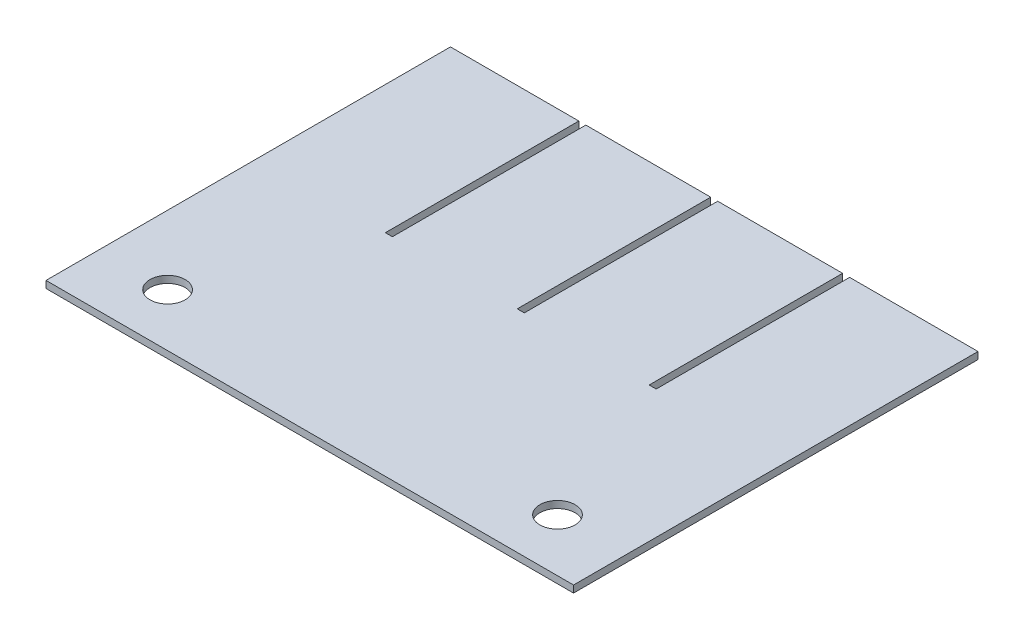
ISO-10303-21;
HEADER;
FILE_DESCRIPTION(('STEP AP214'),'2;1');
FILE_NAME('part.step','',(''),(''),'','','');
FILE_SCHEMA(('AUTOMOTIVE_DESIGN { 1 0 10303 214 1 1 1 1 }'));
ENDSEC;
DATA;
#1=APPLICATION_CONTEXT('core data for automotive mechanical design processes');
#2=APPLICATION_PROTOCOL_DEFINITION('international standard','automotive_design',2000,#1);
#3=PRODUCT_CONTEXT('',#1,'mechanical');
#4=PRODUCT('Part','Part','',(#3));
#5=PRODUCT_RELATED_PRODUCT_CATEGORY('part','',(#4));
#6=PRODUCT_DEFINITION_FORMATION('','',#4);
#7=PRODUCT_DEFINITION_CONTEXT('part definition',#1,'design');
#8=PRODUCT_DEFINITION('design','',#6,#7);
#9=PRODUCT_DEFINITION_SHAPE('','',#8);
#10=(LENGTH_UNIT() NAMED_UNIT(*) SI_UNIT(.MILLI.,.METRE.));
#11=(NAMED_UNIT(*) PLANE_ANGLE_UNIT() SI_UNIT($,.RADIAN.));
#12=(NAMED_UNIT(*) SI_UNIT($,.STERADIAN.) SOLID_ANGLE_UNIT());
#13=UNCERTAINTY_MEASURE_WITH_UNIT(LENGTH_MEASURE(1.E-05),#10,'distance_accuracy_value','');
#14=(GEOMETRIC_REPRESENTATION_CONTEXT(3) GLOBAL_UNCERTAINTY_ASSIGNED_CONTEXT((#13)) GLOBAL_UNIT_ASSIGNED_CONTEXT((#10,
#11,#12)) REPRESENTATION_CONTEXT('',''));
#15=CARTESIAN_POINT('',(0.,0.,0.));
#16=DIRECTION('',(0.,0.,1.));
#17=DIRECTION('',(1.,0.,0.));
#18=AXIS2_PLACEMENT_3D('',#15,#16,#17);
#19=CARTESIAN_POINT('',(0.,2.,0.));
#20=DIRECTION('',(0.,1.,0.));
#21=DIRECTION('',(0.,0.,1.));
#22=AXIS2_PLACEMENT_3D('',#19,#20,#21);
#23=PLANE('',#22);
#24=CARTESIAN_POINT('',(-55.4347826086956,2.,42.5));
#25=DIRECTION('',(0.,1.,0.));
#26=DIRECTION('',(0.,0.,1.));
#27=AXIS2_PLACEMENT_3D('',#24,#25,#26);
#28=CIRCLE('',#27,5.);
#29=CARTESIAN_POINT('',(-55.4347826086956,2.,47.5));
#30=VERTEX_POINT('',#29);
#31=EDGE_CURVE('E188',#30,#30,#28,.T.);
#32=ORIENTED_EDGE('',*,*,#31,.F.);
#33=EDGE_LOOP('',(#32));
#34=FACE_BOUND('',#33,.T.);
#35=DIRECTION('',(0.,0.,-1.));
#36=VECTOR('',#35,1.);
#37=CARTESIAN_POINT('',(75.,2.,-57.5));
#38=LINE('',#37,#36);
#39=CARTESIAN_POINT('',(75.,2.,57.5));
#40=VERTEX_POINT('',#39);
#41=CARTESIAN_POINT('',(75.,2.,-57.5));
#42=VERTEX_POINT('',#41);
#43=EDGE_CURVE('E215',#40,#42,#38,.T.);
#44=ORIENTED_EDGE('',*,*,#43,.T.);
#45=DIRECTION('',(-1.,0.,0.));
#46=VECTOR('',#45,1.);
#47=CARTESIAN_POINT('',(38.5,2.,-57.5));
#48=LINE('',#47,#46);
#49=CARTESIAN_POINT('',(38.5,2.,-57.5));
#50=VERTEX_POINT('',#49);
#51=EDGE_CURVE('E123',#42,#50,#48,.T.);
#52=ORIENTED_EDGE('',*,*,#51,.T.);
#53=DIRECTION('',(0.,0.,1.));
#54=VECTOR('',#53,1.);
#55=CARTESIAN_POINT('',(38.5,2.,-57.5));
#56=LINE('',#55,#54);
#57=CARTESIAN_POINT('',(38.5,2.,-2.5));
#58=VERTEX_POINT('',#57);
#59=EDGE_CURVE('E254',#50,#58,#56,.T.);
#60=ORIENTED_EDGE('',*,*,#59,.T.);
#61=DIRECTION('',(-1.,0.,0.));
#62=VECTOR('',#61,1.);
#63=CARTESIAN_POINT('',(38.5,2.,-2.5));
#64=LINE('',#63,#62);
#65=CARTESIAN_POINT('',(36.5,2.,-2.5));
#66=VERTEX_POINT('',#65);
#67=EDGE_CURVE('E273',#58,#66,#64,.T.);
#68=ORIENTED_EDGE('',*,*,#67,.T.);
#69=DIRECTION('',(0.,0.,-1.));
#70=VECTOR('',#69,1.);
#71=CARTESIAN_POINT('',(36.5,2.,-57.5));
#72=LINE('',#71,#70);
#73=CARTESIAN_POINT('',(36.5,2.,-57.5));
#74=VERTEX_POINT('',#73);
#75=EDGE_CURVE('E270',#66,#74,#72,.T.);
#76=ORIENTED_EDGE('',*,*,#75,.T.);
#77=DIRECTION('',(-1.,0.,0.));
#78=VECTOR('',#77,1.);
#79=CARTESIAN_POINT('',(1.00000000000003,2.,-57.5));
#80=LINE('',#79,#78);
#81=CARTESIAN_POINT('',(1.00000000000003,2.,-57.5));
#82=VERTEX_POINT('',#81);
#83=EDGE_CURVE('E272',#74,#82,#80,.T.);
#84=ORIENTED_EDGE('',*,*,#83,.T.);
#85=DIRECTION('',(0.,0.,1.));
#86=VECTOR('',#85,1.);
#87=CARTESIAN_POINT('',(1.00000000000003,2.,-57.5));
#88=LINE('',#87,#86);
#89=CARTESIAN_POINT('',(1.00000000000003,2.,-2.5));
#90=VERTEX_POINT('',#89);
#91=EDGE_CURVE('E275',#82,#90,#88,.T.);
#92=ORIENTED_EDGE('',*,*,#91,.T.);
#93=DIRECTION('',(-1.,0.,0.));
#94=VECTOR('',#93,1.);
#95=CARTESIAN_POINT('',(-0.999999999999966,2.,-2.5));
#96=LINE('',#95,#94);
#97=CARTESIAN_POINT('',(-0.999999999999966,2.,-2.5));
#98=VERTEX_POINT('',#97);
#99=EDGE_CURVE('E281',#90,#98,#96,.T.);
#100=ORIENTED_EDGE('',*,*,#99,.T.);
#101=DIRECTION('',(0.,0.,-1.));
#102=VECTOR('',#101,1.);
#103=CARTESIAN_POINT('',(-0.999999999999973,2.,-57.5));
#104=LINE('',#103,#102);
#105=CARTESIAN_POINT('',(-0.999999999999973,2.,-57.5));
#106=VERTEX_POINT('',#105);
#107=EDGE_CURVE('E283',#98,#106,#104,.T.);
#108=ORIENTED_EDGE('',*,*,#107,.T.);
#109=DIRECTION('',(-1.,0.,0.));
#110=VECTOR('',#109,1.);
#111=CARTESIAN_POINT('',(-36.5,2.,-57.5));
#112=LINE('',#111,#110);
#113=CARTESIAN_POINT('',(-36.5,2.,-57.5));
#114=VERTEX_POINT('',#113);
#115=EDGE_CURVE('E285',#106,#114,#112,.T.);
#116=ORIENTED_EDGE('',*,*,#115,.T.);
#117=DIRECTION('',(0.,0.,1.));
#118=VECTOR('',#117,1.);
#119=CARTESIAN_POINT('',(-36.5,2.,-57.5));
#120=LINE('',#119,#118);
#121=CARTESIAN_POINT('',(-36.5,2.,-2.5));
#122=VERTEX_POINT('',#121);
#123=EDGE_CURVE('E287',#114,#122,#120,.T.);
#124=ORIENTED_EDGE('',*,*,#123,.T.);
#125=DIRECTION('',(-1.,0.,0.));
#126=VECTOR('',#125,1.);
#127=CARTESIAN_POINT('',(-38.5,2.,-2.5));
#128=LINE('',#127,#126);
#129=CARTESIAN_POINT('',(-38.5,2.,-2.5));
#130=VERTEX_POINT('',#129);
#131=EDGE_CURVE('E289',#122,#130,#128,.T.);
#132=ORIENTED_EDGE('',*,*,#131,.T.);
#133=DIRECTION('',(0.,0.,-1.));
#134=VECTOR('',#133,1.);
#135=CARTESIAN_POINT('',(-38.5,2.,-57.5));
#136=LINE('',#135,#134);
#137=CARTESIAN_POINT('',(-38.5,2.,-57.5));
#138=VERTEX_POINT('',#137);
#139=EDGE_CURVE('E166',#130,#138,#136,.T.);
#140=ORIENTED_EDGE('',*,*,#139,.T.);
#141=DIRECTION('',(-1.,0.,0.));
#142=VECTOR('',#141,1.);
#143=CARTESIAN_POINT('',(-75.,2.,-57.5));
#144=LINE('',#143,#142);
#145=CARTESIAN_POINT('',(-75.,2.,-57.5));
#146=VERTEX_POINT('',#145);
#147=EDGE_CURVE('E160',#138,#146,#144,.T.);
#148=ORIENTED_EDGE('',*,*,#147,.T.);
#149=DIRECTION('',(0.,0.,1.));
#150=VECTOR('',#149,1.);
#151=CARTESIAN_POINT('',(-75.,2.,-57.5));
#152=LINE('',#151,#150);
#153=CARTESIAN_POINT('',(-75.,2.,57.5));
#154=VERTEX_POINT('',#153);
#155=EDGE_CURVE('E164',#146,#154,#152,.T.);
#156=ORIENTED_EDGE('',*,*,#155,.T.);
#157=DIRECTION('',(1.,0.,0.));
#158=VECTOR('',#157,1.);
#159=CARTESIAN_POINT('',(-75.,2.,57.5));
#160=LINE('',#159,#158);
#161=EDGE_CURVE('E56',#154,#40,#160,.T.);
#162=ORIENTED_EDGE('',*,*,#161,.T.);
#163=EDGE_LOOP('',(#44,#52,#60,#68,#76,#84,#92,#100,#108,#116,#124,#132,#140,#148,#156,#162));
#164=FACE_BOUND('',#163,.T.);
#165=CARTESIAN_POINT('',(55.4347826086957,2.,42.5));
#166=DIRECTION('',(0.,1.,0.));
#167=DIRECTION('',(0.,0.,1.));
#168=AXIS2_PLACEMENT_3D('',#165,#166,#167);
#169=CIRCLE('',#168,5.);
#170=CARTESIAN_POINT('',(55.4347826086957,2.,47.5));
#171=VERTEX_POINT('',#170);
#172=EDGE_CURVE('E331',#171,#171,#169,.T.);
#173=ORIENTED_EDGE('',*,*,#172,.F.);
#174=EDGE_LOOP('',(#173));
#175=FACE_BOUND('',#174,.T.);
#176=ADVANCED_FACE('F39',(#34,#164,#175),#23,.T.);
#177=CARTESIAN_POINT('',(0.,0.,0.));
#178=DIRECTION('',(0.,1.,0.));
#179=DIRECTION('',(0.,0.,1.));
#180=AXIS2_PLACEMENT_3D('',#177,#178,#179);
#181=PLANE('',#180);
#182=DIRECTION('',(0.,0.,-1.));
#183=VECTOR('',#182,1.);
#184=CARTESIAN_POINT('',(75.,0.,-57.5));
#185=LINE('',#184,#183);
#186=CARTESIAN_POINT('',(75.,0.,57.5));
#187=VERTEX_POINT('',#186);
#188=CARTESIAN_POINT('',(75.,0.,-57.5));
#189=VERTEX_POINT('',#188);
#190=EDGE_CURVE('E184',#187,#189,#185,.T.);
#191=ORIENTED_EDGE('',*,*,#190,.F.);
#192=DIRECTION('',(1.,0.,0.));
#193=VECTOR('',#192,1.);
#194=CARTESIAN_POINT('',(-75.,0.,57.5));
#195=LINE('',#194,#193);
#196=CARTESIAN_POINT('',(-75.,0.,57.5));
#197=VERTEX_POINT('',#196);
#198=EDGE_CURVE('E115',#197,#187,#195,.T.);
#199=ORIENTED_EDGE('',*,*,#198,.F.);
#200=DIRECTION('',(0.,0.,1.));
#201=VECTOR('',#200,1.);
#202=CARTESIAN_POINT('',(-75.,0.,-57.5));
#203=LINE('',#202,#201);
#204=CARTESIAN_POINT('',(-75.,0.,-57.5));
#205=VERTEX_POINT('',#204);
#206=EDGE_CURVE('E109',#205,#197,#203,.T.);
#207=ORIENTED_EDGE('',*,*,#206,.F.);
#208=DIRECTION('',(-1.,0.,0.));
#209=VECTOR('',#208,1.);
#210=CARTESIAN_POINT('',(-75.,0.,-57.5));
#211=LINE('',#210,#209);
#212=CARTESIAN_POINT('',(-38.5,0.,-57.5));
#213=VERTEX_POINT('',#212);
#214=EDGE_CURVE('E174',#213,#205,#211,.T.);
#215=ORIENTED_EDGE('',*,*,#214,.F.);
#216=DIRECTION('',(0.,0.,-1.));
#217=VECTOR('',#216,1.);
#218=CARTESIAN_POINT('',(-38.5,0.,-57.5));
#219=LINE('',#218,#217);
#220=CARTESIAN_POINT('',(-38.5,0.,-2.5));
#221=VERTEX_POINT('',#220);
#222=EDGE_CURVE('E210',#221,#213,#219,.T.);
#223=ORIENTED_EDGE('',*,*,#222,.F.);
#224=DIRECTION('',(-1.,0.,0.));
#225=VECTOR('',#224,1.);
#226=CARTESIAN_POINT('',(-38.5,0.,-2.5));
#227=LINE('',#226,#225);
#228=CARTESIAN_POINT('',(-36.5,0.,-2.5));
#229=VERTEX_POINT('',#228);
#230=EDGE_CURVE('E208',#229,#221,#227,.T.);
#231=ORIENTED_EDGE('',*,*,#230,.F.);
#232=DIRECTION('',(0.,0.,1.));
#233=VECTOR('',#232,1.);
#234=CARTESIAN_POINT('',(-36.5,0.,-57.5));
#235=LINE('',#234,#233);
#236=CARTESIAN_POINT('',(-36.5,0.,-57.5));
#237=VERTEX_POINT('',#236);
#238=EDGE_CURVE('E206',#237,#229,#235,.T.);
#239=ORIENTED_EDGE('',*,*,#238,.F.);
#240=DIRECTION('',(-1.,0.,0.));
#241=VECTOR('',#240,1.);
#242=CARTESIAN_POINT('',(-36.5,0.,-57.5));
#243=LINE('',#242,#241);
#244=CARTESIAN_POINT('',(-0.999999999999973,0.,-57.5));
#245=VERTEX_POINT('',#244);
#246=EDGE_CURVE('E204',#245,#237,#243,.T.);
#247=ORIENTED_EDGE('',*,*,#246,.F.);
#248=DIRECTION('',(0.,0.,-1.));
#249=VECTOR('',#248,1.);
#250=CARTESIAN_POINT('',(-0.999999999999973,0.,-57.5));
#251=LINE('',#250,#249);
#252=CARTESIAN_POINT('',(-0.999999999999966,0.,-2.5));
#253=VERTEX_POINT('',#252);
#254=EDGE_CURVE('E202',#253,#245,#251,.T.);
#255=ORIENTED_EDGE('',*,*,#254,.F.);
#256=DIRECTION('',(-1.,0.,0.));
#257=VECTOR('',#256,1.);
#258=CARTESIAN_POINT('',(-0.999999999999966,0.,-2.5));
#259=LINE('',#258,#257);
#260=CARTESIAN_POINT('',(1.00000000000003,0.,-2.5));
#261=VERTEX_POINT('',#260);
#262=EDGE_CURVE('E200',#261,#253,#259,.T.);
#263=ORIENTED_EDGE('',*,*,#262,.F.);
#264=DIRECTION('',(0.,0.,1.));
#265=VECTOR('',#264,1.);
#266=CARTESIAN_POINT('',(1.00000000000003,0.,-57.5));
#267=LINE('',#266,#265);
#268=CARTESIAN_POINT('',(1.00000000000003,0.,-57.5));
#269=VERTEX_POINT('',#268);
#270=EDGE_CURVE('E198',#269,#261,#267,.T.);
#271=ORIENTED_EDGE('',*,*,#270,.F.);
#272=DIRECTION('',(-1.,0.,0.));
#273=VECTOR('',#272,1.);
#274=CARTESIAN_POINT('',(1.00000000000003,0.,-57.5));
#275=LINE('',#274,#273);
#276=CARTESIAN_POINT('',(36.5,0.,-57.5));
#277=VERTEX_POINT('',#276);
#278=EDGE_CURVE('E196',#277,#269,#275,.T.);
#279=ORIENTED_EDGE('',*,*,#278,.F.);
#280=DIRECTION('',(0.,0.,-1.));
#281=VECTOR('',#280,1.);
#282=CARTESIAN_POINT('',(36.5,0.,-57.5));
#283=LINE('',#282,#281);
#284=CARTESIAN_POINT('',(36.5,0.,-2.5));
#285=VERTEX_POINT('',#284);
#286=EDGE_CURVE('E194',#285,#277,#283,.T.);
#287=ORIENTED_EDGE('',*,*,#286,.F.);
#288=DIRECTION('',(-1.,0.,0.));
#289=VECTOR('',#288,1.);
#290=CARTESIAN_POINT('',(38.5,0.,-2.5));
#291=LINE('',#290,#289);
#292=CARTESIAN_POINT('',(38.5,0.,-2.5));
#293=VERTEX_POINT('',#292);
#294=EDGE_CURVE('E192',#293,#285,#291,.T.);
#295=ORIENTED_EDGE('',*,*,#294,.F.);
#296=DIRECTION('',(0.,0.,1.));
#297=VECTOR('',#296,1.);
#298=CARTESIAN_POINT('',(38.5,0.,-57.5));
#299=LINE('',#298,#297);
#300=CARTESIAN_POINT('',(38.5,0.,-57.5));
#301=VERTEX_POINT('',#300);
#302=EDGE_CURVE('E190',#301,#293,#299,.T.);
#303=ORIENTED_EDGE('',*,*,#302,.F.);
#304=DIRECTION('',(-1.,0.,0.));
#305=VECTOR('',#304,1.);
#306=CARTESIAN_POINT('',(38.5,0.,-57.5));
#307=LINE('',#306,#305);
#308=EDGE_CURVE('E187',#189,#301,#307,.T.);
#309=ORIENTED_EDGE('',*,*,#308,.F.);
#310=EDGE_LOOP('',(#191,#199,#207,#215,#223,#231,#239,#247,#255,#263,#271,#279,#287,#295,#303,#309));
#311=FACE_BOUND('',#310,.T.);
#312=CARTESIAN_POINT('',(-55.4347826086956,0.,42.5));
#313=DIRECTION('',(0.,1.,0.));
#314=DIRECTION('',(0.,0.,1.));
#315=AXIS2_PLACEMENT_3D('',#312,#313,#314);
#316=CIRCLE('',#315,5.);
#317=CARTESIAN_POINT('',(-55.4347826086956,0.,47.5));
#318=VERTEX_POINT('',#317);
#319=EDGE_CURVE('E337',#318,#318,#316,.T.);
#320=ORIENTED_EDGE('',*,*,#319,.T.);
#321=EDGE_LOOP('',(#320));
#322=FACE_BOUND('',#321,.T.);
#323=CARTESIAN_POINT('',(55.4347826086957,0.,42.5));
#324=DIRECTION('',(0.,1.,0.));
#325=DIRECTION('',(0.,0.,1.));
#326=AXIS2_PLACEMENT_3D('',#323,#324,#325);
#327=CIRCLE('',#326,5.);
#328=CARTESIAN_POINT('',(55.4347826086957,0.,47.5));
#329=VERTEX_POINT('',#328);
#330=EDGE_CURVE('E334',#329,#329,#327,.T.);
#331=ORIENTED_EDGE('',*,*,#330,.T.);
#332=EDGE_LOOP('',(#331));
#333=FACE_BOUND('',#332,.T.);
#334=ADVANCED_FACE('F258',(#311,#322,#333),#181,.F.);
#335=CARTESIAN_POINT('',(75.,2.,-57.5));
#336=DIRECTION('',(-1.,0.,0.));
#337=DIRECTION('',(0.,0.,1.));
#338=AXIS2_PLACEMENT_3D('',#335,#336,#337);
#339=PLANE('',#338);
#340=ORIENTED_EDGE('',*,*,#190,.T.);
#341=DIRECTION('',(0.,-1.,0.));
#342=VECTOR('',#341,1.);
#343=CARTESIAN_POINT('',(75.,2.,-57.5));
#344=LINE('',#343,#342);
#345=EDGE_CURVE('E11',#42,#189,#344,.T.);
#346=ORIENTED_EDGE('',*,*,#345,.F.);
#347=ORIENTED_EDGE('',*,*,#43,.F.);
#348=DIRECTION('',(0.,-1.,0.));
#349=VECTOR('',#348,1.);
#350=CARTESIAN_POINT('',(75.,2.,57.5));
#351=LINE('',#350,#349);
#352=EDGE_CURVE('E180',#40,#187,#351,.T.);
#353=ORIENTED_EDGE('',*,*,#352,.T.);
#354=EDGE_LOOP('',(#340,#346,#347,#353));
#355=FACE_BOUND('',#354,.T.);
#356=ADVANCED_FACE('F41',(#355),#339,.F.);
#357=CARTESIAN_POINT('',(38.5,2.,-57.5));
#358=DIRECTION('',(0.,0.,1.));
#359=DIRECTION('',(1.,0.,0.));
#360=AXIS2_PLACEMENT_3D('',#357,#358,#359);
#361=PLANE('',#360);
#362=ORIENTED_EDGE('',*,*,#308,.T.);
#363=DIRECTION('',(0.,-1.,0.));
#364=VECTOR('',#363,1.);
#365=CARTESIAN_POINT('',(38.5,2.,-57.5));
#366=LINE('',#365,#364);
#367=EDGE_CURVE('E48',#50,#301,#366,.T.);
#368=ORIENTED_EDGE('',*,*,#367,.F.);
#369=ORIENTED_EDGE('',*,*,#51,.F.);
#370=ORIENTED_EDGE('',*,*,#345,.T.);
#371=EDGE_LOOP('',(#362,#368,#369,#370));
#372=FACE_BOUND('',#371,.T.);
#373=ADVANCED_FACE('F484',(#372),#361,.F.);
#374=CARTESIAN_POINT('',(38.5,2.,-57.5));
#375=DIRECTION('',(1.,0.,0.));
#376=DIRECTION('',(0.,0.,-1.));
#377=AXIS2_PLACEMENT_3D('',#374,#375,#376);
#378=PLANE('',#377);
#379=ORIENTED_EDGE('',*,*,#302,.T.);
#380=DIRECTION('',(0.,-1.,0.));
#381=VECTOR('',#380,1.);
#382=CARTESIAN_POINT('',(38.5,2.,-2.5));
#383=LINE('',#382,#381);
#384=EDGE_CURVE('E246',#58,#293,#383,.T.);
#385=ORIENTED_EDGE('',*,*,#384,.F.);
#386=ORIENTED_EDGE('',*,*,#59,.F.);
#387=ORIENTED_EDGE('',*,*,#367,.T.);
#388=EDGE_LOOP('',(#379,#385,#386,#387));
#389=FACE_BOUND('',#388,.T.);
#390=ADVANCED_FACE('F252',(#389),#378,.F.);
#391=CARTESIAN_POINT('',(38.5,2.,-2.5));
#392=DIRECTION('',(0.,0.,1.));
#393=DIRECTION('',(1.,0.,0.));
#394=AXIS2_PLACEMENT_3D('',#391,#392,#393);
#395=PLANE('',#394);
#396=ORIENTED_EDGE('',*,*,#294,.T.);
#397=DIRECTION('',(0.,-1.,0.));
#398=VECTOR('',#397,1.);
#399=CARTESIAN_POINT('',(36.5,2.,-2.5));
#400=LINE('',#399,#398);
#401=EDGE_CURVE('E243',#66,#285,#400,.T.);
#402=ORIENTED_EDGE('',*,*,#401,.F.);
#403=ORIENTED_EDGE('',*,*,#67,.F.);
#404=ORIENTED_EDGE('',*,*,#384,.T.);
#405=EDGE_LOOP('',(#396,#402,#403,#404));
#406=FACE_BOUND('',#405,.T.);
#407=ADVANCED_FACE('F264',(#406),#395,.F.);
#408=CARTESIAN_POINT('',(36.5,2.,-57.5));
#409=DIRECTION('',(-1.,0.,0.));
#410=DIRECTION('',(0.,0.,1.));
#411=AXIS2_PLACEMENT_3D('',#408,#409,#410);
#412=PLANE('',#411);
#413=ORIENTED_EDGE('',*,*,#286,.T.);
#414=DIRECTION('',(0.,-1.,0.));
#415=VECTOR('',#414,1.);
#416=CARTESIAN_POINT('',(36.5,2.,-57.5));
#417=LINE('',#416,#415);
#418=EDGE_CURVE('E240',#74,#277,#417,.T.);
#419=ORIENTED_EDGE('',*,*,#418,.F.);
#420=ORIENTED_EDGE('',*,*,#75,.F.);
#421=ORIENTED_EDGE('',*,*,#401,.T.);
#422=EDGE_LOOP('',(#413,#419,#420,#421));
#423=FACE_BOUND('',#422,.T.);
#424=ADVANCED_FACE('F268',(#423),#412,.F.);
#425=CARTESIAN_POINT('',(1.00000000000003,2.,-57.5));
#426=DIRECTION('',(0.,0.,1.));
#427=DIRECTION('',(1.,0.,0.));
#428=AXIS2_PLACEMENT_3D('',#425,#426,#427);
#429=PLANE('',#428);
#430=ORIENTED_EDGE('',*,*,#278,.T.);
#431=DIRECTION('',(0.,-1.,0.));
#432=VECTOR('',#431,1.);
#433=CARTESIAN_POINT('',(1.00000000000003,2.,-57.5));
#434=LINE('',#433,#432);
#435=EDGE_CURVE('E237',#82,#269,#434,.T.);
#436=ORIENTED_EDGE('',*,*,#435,.F.);
#437=ORIENTED_EDGE('',*,*,#83,.F.);
#438=ORIENTED_EDGE('',*,*,#418,.T.);
#439=EDGE_LOOP('',(#430,#436,#437,#438));
#440=FACE_BOUND('',#439,.T.);
#441=ADVANCED_FACE('F445',(#440),#429,.F.);
#442=CARTESIAN_POINT('',(1.00000000000003,2.,-57.5));
#443=DIRECTION('',(1.,0.,0.));
#444=DIRECTION('',(0.,0.,-1.));
#445=AXIS2_PLACEMENT_3D('',#442,#443,#444);
#446=PLANE('',#445);
#447=ORIENTED_EDGE('',*,*,#270,.T.);
#448=DIRECTION('',(0.,-1.,0.));
#449=VECTOR('',#448,1.);
#450=CARTESIAN_POINT('',(1.00000000000003,2.,-2.5));
#451=LINE('',#450,#449);
#452=EDGE_CURVE('E234',#90,#261,#451,.T.);
#453=ORIENTED_EDGE('',*,*,#452,.F.);
#454=ORIENTED_EDGE('',*,*,#91,.F.);
#455=ORIENTED_EDGE('',*,*,#435,.T.);
#456=EDGE_LOOP('',(#447,#453,#454,#455));
#457=FACE_BOUND('',#456,.T.);
#458=ADVANCED_FACE('F434',(#457),#446,.F.);
#459=CARTESIAN_POINT('',(-0.999999999999966,2.,-2.5));
#460=DIRECTION('',(0.,0.,1.));
#461=DIRECTION('',(1.,0.,0.));
#462=AXIS2_PLACEMENT_3D('',#459,#460,#461);
#463=PLANE('',#462);
#464=ORIENTED_EDGE('',*,*,#262,.T.);
#465=DIRECTION('',(0.,-1.,0.));
#466=VECTOR('',#465,1.);
#467=CARTESIAN_POINT('',(-0.999999999999966,2.,-2.5));
#468=LINE('',#467,#466);
#469=EDGE_CURVE('E231',#98,#253,#468,.T.);
#470=ORIENTED_EDGE('',*,*,#469,.F.);
#471=ORIENTED_EDGE('',*,*,#99,.F.);
#472=ORIENTED_EDGE('',*,*,#452,.T.);
#473=EDGE_LOOP('',(#464,#470,#471,#472));
#474=FACE_BOUND('',#473,.T.);
#475=ADVANCED_FACE('F423',(#474),#463,.F.);
#476=CARTESIAN_POINT('',(-0.999999999999973,2.,-57.5));
#477=DIRECTION('',(-1.,0.,0.));
#478=DIRECTION('',(0.,0.,1.));
#479=AXIS2_PLACEMENT_3D('',#476,#477,#478);
#480=PLANE('',#479);
#481=ORIENTED_EDGE('',*,*,#254,.T.);
#482=DIRECTION('',(0.,-1.,0.));
#483=VECTOR('',#482,1.);
#484=CARTESIAN_POINT('',(-0.999999999999973,2.,-57.5));
#485=LINE('',#484,#483);
#486=EDGE_CURVE('E228',#106,#245,#485,.T.);
#487=ORIENTED_EDGE('',*,*,#486,.F.);
#488=ORIENTED_EDGE('',*,*,#107,.F.);
#489=ORIENTED_EDGE('',*,*,#469,.T.);
#490=EDGE_LOOP('',(#481,#487,#488,#489));
#491=FACE_BOUND('',#490,.T.);
#492=ADVANCED_FACE('F412',(#491),#480,.F.);
#493=CARTESIAN_POINT('',(-36.5,2.,-57.5));
#494=DIRECTION('',(0.,0.,1.));
#495=DIRECTION('',(1.,0.,0.));
#496=AXIS2_PLACEMENT_3D('',#493,#494,#495);
#497=PLANE('',#496);
#498=ORIENTED_EDGE('',*,*,#246,.T.);
#499=DIRECTION('',(0.,-1.,0.));
#500=VECTOR('',#499,1.);
#501=CARTESIAN_POINT('',(-36.5,2.,-57.5));
#502=LINE('',#501,#500);
#503=EDGE_CURVE('E225',#114,#237,#502,.T.);
#504=ORIENTED_EDGE('',*,*,#503,.F.);
#505=ORIENTED_EDGE('',*,*,#115,.F.);
#506=ORIENTED_EDGE('',*,*,#486,.T.);
#507=EDGE_LOOP('',(#498,#504,#505,#506));
#508=FACE_BOUND('',#507,.T.);
#509=ADVANCED_FACE('F401',(#508),#497,.F.);
#510=CARTESIAN_POINT('',(-36.5,2.,-57.5));
#511=DIRECTION('',(1.,0.,0.));
#512=DIRECTION('',(0.,0.,-1.));
#513=AXIS2_PLACEMENT_3D('',#510,#511,#512);
#514=PLANE('',#513);
#515=ORIENTED_EDGE('',*,*,#238,.T.);
#516=DIRECTION('',(0.,-1.,0.));
#517=VECTOR('',#516,1.);
#518=CARTESIAN_POINT('',(-36.5,2.,-2.5));
#519=LINE('',#518,#517);
#520=EDGE_CURVE('E222',#122,#229,#519,.T.);
#521=ORIENTED_EDGE('',*,*,#520,.F.);
#522=ORIENTED_EDGE('',*,*,#123,.F.);
#523=ORIENTED_EDGE('',*,*,#503,.T.);
#524=EDGE_LOOP('',(#515,#521,#522,#523));
#525=FACE_BOUND('',#524,.T.);
#526=ADVANCED_FACE('F391',(#525),#514,.F.);
#527=CARTESIAN_POINT('',(-38.5,2.,-2.5));
#528=DIRECTION('',(0.,0.,1.));
#529=DIRECTION('',(1.,0.,0.));
#530=AXIS2_PLACEMENT_3D('',#527,#528,#529);
#531=PLANE('',#530);
#532=ORIENTED_EDGE('',*,*,#230,.T.);
#533=DIRECTION('',(0.,-1.,0.));
#534=VECTOR('',#533,1.);
#535=CARTESIAN_POINT('',(-38.5,2.,-2.5));
#536=LINE('',#535,#534);
#537=EDGE_CURVE('E219',#130,#221,#536,.T.);
#538=ORIENTED_EDGE('',*,*,#537,.F.);
#539=ORIENTED_EDGE('',*,*,#131,.F.);
#540=ORIENTED_EDGE('',*,*,#520,.T.);
#541=EDGE_LOOP('',(#532,#538,#539,#540));
#542=FACE_BOUND('',#541,.T.);
#543=ADVANCED_FACE('F295',(#542),#531,.F.);
#544=CARTESIAN_POINT('',(-38.5,2.,-57.5));
#545=DIRECTION('',(-1.,0.,0.));
#546=DIRECTION('',(0.,0.,1.));
#547=AXIS2_PLACEMENT_3D('',#544,#545,#546);
#548=PLANE('',#547);
#549=ORIENTED_EDGE('',*,*,#222,.T.);
#550=DIRECTION('',(0.,-1.,0.));
#551=VECTOR('',#550,1.);
#552=CARTESIAN_POINT('',(-38.5,2.,-57.5));
#553=LINE('',#552,#551);
#554=EDGE_CURVE('E175',#138,#213,#553,.T.);
#555=ORIENTED_EDGE('',*,*,#554,.F.);
#556=ORIENTED_EDGE('',*,*,#139,.F.);
#557=ORIENTED_EDGE('',*,*,#537,.T.);
#558=EDGE_LOOP('',(#549,#555,#556,#557));
#559=FACE_BOUND('',#558,.T.);
#560=ADVANCED_FACE('F299',(#559),#548,.F.);
#561=CARTESIAN_POINT('',(-75.,2.,-57.5));
#562=DIRECTION('',(0.,0.,1.));
#563=DIRECTION('',(1.,0.,0.));
#564=AXIS2_PLACEMENT_3D('',#561,#562,#563);
#565=PLANE('',#564);
#566=ORIENTED_EDGE('',*,*,#214,.T.);
#567=DIRECTION('',(0.,-1.,0.));
#568=VECTOR('',#567,1.);
#569=CARTESIAN_POINT('',(-75.,2.,-57.5));
#570=LINE('',#569,#568);
#571=EDGE_CURVE('E171',#146,#205,#570,.T.);
#572=ORIENTED_EDGE('',*,*,#571,.F.);
#573=ORIENTED_EDGE('',*,*,#147,.F.);
#574=ORIENTED_EDGE('',*,*,#554,.T.);
#575=EDGE_LOOP('',(#566,#572,#573,#574));
#576=FACE_BOUND('',#575,.T.);
#577=ADVANCED_FACE('F172',(#576),#565,.F.);
#578=CARTESIAN_POINT('',(-75.,2.,-57.5));
#579=DIRECTION('',(1.,0.,0.));
#580=DIRECTION('',(0.,0.,-1.));
#581=AXIS2_PLACEMENT_3D('',#578,#579,#580);
#582=PLANE('',#581);
#583=ORIENTED_EDGE('',*,*,#206,.T.);
#584=DIRECTION('',(0.,-1.,0.));
#585=VECTOR('',#584,1.);
#586=CARTESIAN_POINT('',(-75.,2.,57.5));
#587=LINE('',#586,#585);
#588=EDGE_CURVE('E176',#154,#197,#587,.T.);
#589=ORIENTED_EDGE('',*,*,#588,.F.);
#590=ORIENTED_EDGE('',*,*,#155,.F.);
#591=ORIENTED_EDGE('',*,*,#571,.T.);
#592=EDGE_LOOP('',(#583,#589,#590,#591));
#593=FACE_BOUND('',#592,.T.);
#594=ADVANCED_FACE('F178',(#593),#582,.F.);
#595=CARTESIAN_POINT('',(-75.,2.,57.5));
#596=DIRECTION('',(0.,0.,-1.));
#597=DIRECTION('',(-1.,0.,0.));
#598=AXIS2_PLACEMENT_3D('',#595,#596,#597);
#599=PLANE('',#598);
#600=ORIENTED_EDGE('',*,*,#198,.T.);
#601=ORIENTED_EDGE('',*,*,#352,.F.);
#602=ORIENTED_EDGE('',*,*,#161,.F.);
#603=ORIENTED_EDGE('',*,*,#588,.T.);
#604=EDGE_LOOP('',(#600,#601,#602,#603));
#605=FACE_BOUND('',#604,.T.);
#606=ADVANCED_FACE('F303',(#605),#599,.F.);
#607=CARTESIAN_POINT('',(-55.4347826086956,2.,42.5));
#608=DIRECTION('',(0.,-1.,0.));
#609=DIRECTION('',(0.,0.,-1.));
#610=AXIS2_PLACEMENT_3D('',#607,#608,#609);
#611=CYLINDRICAL_SURFACE('',#610,5.);
#612=ORIENTED_EDGE('',*,*,#31,.T.);
#613=EDGE_LOOP('',(#612));
#614=FACE_BOUND('',#613,.T.);
#615=ORIENTED_EDGE('',*,*,#319,.F.);
#616=EDGE_LOOP('',(#615));
#617=FACE_BOUND('',#616,.T.);
#618=ADVANCED_FACE('F305',(#614,#617),#611,.F.);
#619=CARTESIAN_POINT('',(55.4347826086957,2.,42.5));
#620=DIRECTION('',(0.,-1.,0.));
#621=DIRECTION('',(0.,0.,-1.));
#622=AXIS2_PLACEMENT_3D('',#619,#620,#621);
#623=CYLINDRICAL_SURFACE('',#622,5.);
#624=ORIENTED_EDGE('',*,*,#172,.T.);
#625=EDGE_LOOP('',(#624));
#626=FACE_BOUND('',#625,.T.);
#627=ORIENTED_EDGE('',*,*,#330,.F.);
#628=EDGE_LOOP('',(#627));
#629=FACE_BOUND('',#628,.T.);
#630=ADVANCED_FACE('F311',(#626,#629),#623,.F.);
#631=CLOSED_SHELL('',(#176,#334,#356,#373,#390,#407,#424,#441,#458,#475,#492,#509,#526,#543,
#560,#577,#594,#606,#618,#630));
#632=MANIFOLD_SOLID_BREP('B2',#631);
#633=ADVANCED_BREP_SHAPE_REPRESENTATION('',(#18,#632),#14);
#634=SHAPE_DEFINITION_REPRESENTATION(#9,#633);
ENDSEC;
END-ISO-10303-21;
